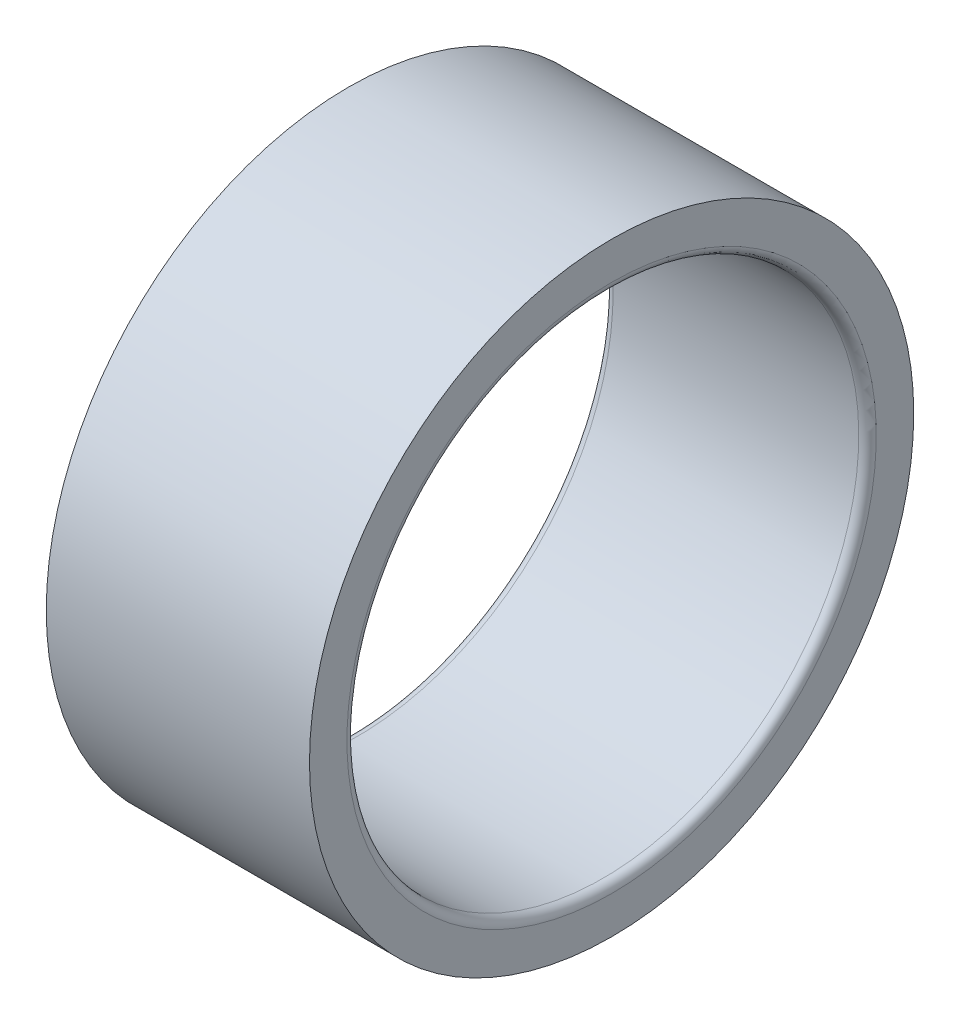
ISO-10303-21;
HEADER;
FILE_DESCRIPTION(('STEP AP214'),'2;1');
FILE_NAME('part.step','',(''),(''),'','','');
FILE_SCHEMA(('AUTOMOTIVE_DESIGN { 1 0 10303 214 1 1 1 1 }'));
ENDSEC;
DATA;
#1=APPLICATION_CONTEXT('core data for automotive mechanical design processes');
#2=APPLICATION_PROTOCOL_DEFINITION('international standard','automotive_design',2000,#1);
#3=PRODUCT_CONTEXT('',#1,'mechanical');
#4=PRODUCT('Part','Part','',(#3));
#5=PRODUCT_RELATED_PRODUCT_CATEGORY('part','',(#4));
#6=PRODUCT_DEFINITION_FORMATION('','',#4);
#7=PRODUCT_DEFINITION_CONTEXT('part definition',#1,'design');
#8=PRODUCT_DEFINITION('design','',#6,#7);
#9=PRODUCT_DEFINITION_SHAPE('','',#8);
#10=(LENGTH_UNIT() NAMED_UNIT(*) SI_UNIT(.MILLI.,.METRE.));
#11=(NAMED_UNIT(*) PLANE_ANGLE_UNIT() SI_UNIT($,.RADIAN.));
#12=(NAMED_UNIT(*) SI_UNIT($,.STERADIAN.) SOLID_ANGLE_UNIT());
#13=UNCERTAINTY_MEASURE_WITH_UNIT(LENGTH_MEASURE(1.E-05),#10,'distance_accuracy_value','');
#14=(GEOMETRIC_REPRESENTATION_CONTEXT(3) GLOBAL_UNCERTAINTY_ASSIGNED_CONTEXT((#13)) GLOBAL_UNIT_ASSIGNED_CONTEXT((#10,
#11,#12)) REPRESENTATION_CONTEXT('',''));
#15=CARTESIAN_POINT('',(0.,0.,0.));
#16=DIRECTION('',(0.,0.,1.));
#17=DIRECTION('',(1.,0.,0.));
#18=AXIS2_PLACEMENT_3D('',#15,#16,#17);
#19=CARTESIAN_POINT('',(23.,19.38,0.));
#20=DIRECTION('',(1.,0.,0.));
#21=DIRECTION('',(0.,1.,0.));
#22=AXIS2_PLACEMENT_3D('',#19,#20,#21);
#23=PLANE('',#22);
#24=CARTESIAN_POINT('',(23.,0.,0.));
#25=DIRECTION('',(1.,0.,0.));
#26=DIRECTION('',(0.,1.,0.));
#27=AXIS2_PLACEMENT_3D('',#24,#25,#26);
#28=CIRCLE('',#27,20.66);
#29=CARTESIAN_POINT('',(23.,20.66,0.));
#30=VERTEX_POINT('',#29);
#31=EDGE_CURVE('E11',#30,#30,#28,.T.);
#32=ORIENTED_EDGE('',*,*,#31,.T.);
#33=EDGE_LOOP('',(#32));
#34=FACE_BOUND('',#33,.T.);
#35=CARTESIAN_POINT('',(23.,0.,0.));
#36=DIRECTION('',(1.,0.,0.));
#37=DIRECTION('',(0.,1.,0.));
#38=AXIS2_PLACEMENT_3D('',#35,#36,#37);
#39=CIRCLE('',#38,18.1);
#40=CARTESIAN_POINT('',(23.,18.1,0.));
#41=VERTEX_POINT('',#40);
#42=EDGE_CURVE('E49',#41,#41,#39,.T.);
#43=ORIENTED_EDGE('',*,*,#42,.F.);
#44=EDGE_LOOP('',(#43));
#45=FACE_BOUND('',#44,.T.);
#46=ADVANCED_FACE('F17',(#34,#45),#23,.T.);
#47=CARTESIAN_POINT('',(14.,0.,0.));
#48=DIRECTION('',(-1.,0.,0.));
#49=DIRECTION('',(0.,1.,0.));
#50=AXIS2_PLACEMENT_3D('',#47,#48,#49);
#51=CYLINDRICAL_SURFACE('',#50,20.66);
#52=CARTESIAN_POINT('',(5.,0.,0.));
#53=DIRECTION('',(1.,0.,0.));
#54=DIRECTION('',(0.,1.,0.));
#55=AXIS2_PLACEMENT_3D('',#52,#53,#54);
#56=CIRCLE('',#55,20.66);
#57=CARTESIAN_POINT('',(5.,20.66,0.));
#58=VERTEX_POINT('',#57);
#59=EDGE_CURVE('E30',#58,#58,#56,.T.);
#60=ORIENTED_EDGE('',*,*,#59,.T.);
#61=EDGE_LOOP('',(#60));
#62=FACE_BOUND('',#61,.T.);
#63=ORIENTED_EDGE('',*,*,#31,.F.);
#64=EDGE_LOOP('',(#63));
#65=FACE_BOUND('',#64,.T.);
#66=ADVANCED_FACE('F85',(#62,#65),#51,.T.);
#67=CARTESIAN_POINT('',(5.,19.38,0.));
#68=DIRECTION('',(-1.,0.,0.));
#69=DIRECTION('',(0.,-1.,0.));
#70=AXIS2_PLACEMENT_3D('',#67,#68,#69);
#71=PLANE('',#70);
#72=CARTESIAN_POINT('',(5.,0.,0.));
#73=DIRECTION('',(1.,0.,0.));
#74=DIRECTION('',(0.,1.,0.));
#75=AXIS2_PLACEMENT_3D('',#72,#73,#74);
#76=CIRCLE('',#75,18.1);
#77=CARTESIAN_POINT('',(5.,18.1,0.));
#78=VERTEX_POINT('',#77);
#79=EDGE_CURVE('E68',#78,#78,#76,.T.);
#80=ORIENTED_EDGE('',*,*,#79,.T.);
#81=EDGE_LOOP('',(#80));
#82=FACE_BOUND('',#81,.T.);
#83=ORIENTED_EDGE('',*,*,#59,.F.);
#84=EDGE_LOOP('',(#83));
#85=FACE_BOUND('',#84,.T.);
#86=ADVANCED_FACE('F88',(#82,#85),#71,.T.);
#87=CARTESIAN_POINT('',(5.6,0.,0.));
#88=DIRECTION('',(1.,0.,0.));
#89=DIRECTION('',(0.,0.,-1.));
#90=AXIS2_PLACEMENT_3D('',#87,#88,#89);
#91=TOROIDAL_SURFACE('',#90,18.1,0.6);
#92=CARTESIAN_POINT('',(5.6,0.,0.));
#93=DIRECTION('',(1.,0.,0.));
#94=DIRECTION('',(0.,1.,0.));
#95=AXIS2_PLACEMENT_3D('',#92,#93,#94);
#96=CIRCLE('',#95,17.5);
#97=CARTESIAN_POINT('',(5.6,17.5,0.));
#98=VERTEX_POINT('',#97);
#99=EDGE_CURVE('E78',#98,#98,#96,.T.);
#100=ORIENTED_EDGE('',*,*,#99,.T.);
#101=EDGE_LOOP('',(#100));
#102=FACE_BOUND('',#101,.T.);
#103=ORIENTED_EDGE('',*,*,#79,.F.);
#104=EDGE_LOOP('',(#103));
#105=FACE_BOUND('',#104,.T.);
#106=ADVANCED_FACE('F90',(#102,#105),#91,.T.);
#107=CARTESIAN_POINT('',(14.,0.,0.));
#108=DIRECTION('',(-1.,0.,0.));
#109=DIRECTION('',(0.,1.,0.));
#110=AXIS2_PLACEMENT_3D('',#107,#108,#109);
#111=CYLINDRICAL_SURFACE('',#110,17.5);
#112=CARTESIAN_POINT('',(22.4,0.,0.));
#113=DIRECTION('',(1.,0.,0.));
#114=DIRECTION('',(0.,1.,0.));
#115=AXIS2_PLACEMENT_3D('',#112,#113,#114);
#116=CIRCLE('',#115,17.5);
#117=CARTESIAN_POINT('',(22.4,17.5,0.));
#118=VERTEX_POINT('',#117);
#119=EDGE_CURVE('E55',#118,#118,#116,.T.);
#120=ORIENTED_EDGE('',*,*,#119,.T.);
#121=EDGE_LOOP('',(#120));
#122=FACE_BOUND('',#121,.T.);
#123=ORIENTED_EDGE('',*,*,#99,.F.);
#124=EDGE_LOOP('',(#123));
#125=FACE_BOUND('',#124,.T.);
#126=CARTESIAN_POINT('',(14.,17.4355957741627,1.50000000000002));
#127=CARTESIAN_POINT('',(14.0165377322841,17.4355962047545,1.49999468184523));
#128=CARTESIAN_POINT('',(14.0330756659081,17.4356193142774,1.49972636292717));
#129=CARTESIAN_POINT('',(14.0660447977551,17.4357111000412,1.4986590580446));
#130=CARTESIAN_POINT('',(14.0824760899928,17.4357795294778,1.49786294632444));
#131=CARTESIAN_POINT('',(14.1152320160811,17.4359617604761,1.49574013476894));
#132=CARTESIAN_POINT('',(14.1315568020204,17.4360753621799,1.49441577202287));
#133=CARTESIAN_POINT('',(14.1640996182594,17.4363475100774,1.49123709098417));
#134=CARTESIAN_POINT('',(14.1803178230468,17.4365059057266,1.4893845476449));
#135=CARTESIAN_POINT('',(14.21264747244,17.4368670916108,1.48515000226908));
#136=CARTESIAN_POINT('',(14.2287590749768,17.437069781389,1.48276919811611));
#137=CARTESIAN_POINT('',(14.2608755408956,17.4375188550157,1.47747867014835));
#138=CARTESIAN_POINT('',(14.2768805058706,17.4377651882524,1.47456955889435));
#139=CARTESIAN_POINT('',(14.3087837576683,17.4383007075638,1.46822292965823));
#140=CARTESIAN_POINT('',(14.3246820498578,17.4385898914654,1.46478543847047));
#141=CARTESIAN_POINT('',(14.3563720711119,17.439210125426,1.45738258916529));
#142=CARTESIAN_POINT('',(14.3721636704323,17.4395412192215,1.45341667936801));
#143=CARTESIAN_POINT('',(14.4036404031676,17.440244156598,1.44495737116878));
#144=CARTESIAN_POINT('',(14.4193252347524,17.4406160862452,1.44046285719836));
#145=CARTESIAN_POINT('',(14.4505887778107,17.4413993972878,1.43094721571647));
#146=CARTESIAN_POINT('',(14.466166982047,17.4418109023805,1.42592443214188));
#147=CARTESIAN_POINT('',(14.4972168534457,17.4426720835717,1.41535112702188));
#148=CARTESIAN_POINT('',(14.512687774789,17.4431219161491,1.40979842974237));
#149=CARTESIAN_POINT('',(14.543525681112,17.4440577463536,1.39817151269828));
#150=CARTESIAN_POINT('',(14.5588916707185,17.4445439241803,1.39209466773268));
#151=CARTESIAN_POINT('',(14.5893339509651,17.4455466735659,1.37947133040457));
#152=CARTESIAN_POINT('',(14.6044113408575,17.4460630716426,1.37292747891924));
#153=CARTESIAN_POINT('',(14.6343712639849,17.4471290692625,1.35931376552878));
#154=CARTESIAN_POINT('',(14.6492532140608,17.447678748784,1.35224262624219));
#155=CARTESIAN_POINT('',(14.6788250082017,17.4488089149655,1.33758055283151));
#156=CARTESIAN_POINT('',(14.693513956967,17.4493895063781,1.32998782213076));
#157=CARTESIAN_POINT('',(14.7226994076792,17.4505795529411,1.31428138878098));
#158=CARTESIAN_POINT('',(14.7371946665711,17.4511891319196,1.30616538618978));
#159=CARTESIAN_POINT('',(14.7659932780111,17.4524349192136,1.28941318121695));
#160=CARTESIAN_POINT('',(14.7802950231629,17.4530712618375,1.28077422675694));
#161=CARTESIAN_POINT('',(14.808706871061,17.4543682542299,1.26297623968503));
#162=CARTESIAN_POINT('',(14.822814986753,17.4550290407734,1.25381404655271));
#163=CARTESIAN_POINT('',(14.8503265528703,17.456347824097,1.23531541376225));
#164=CARTESIAN_POINT('',(14.8637385801868,17.4570053481119,1.22599169187315));
#165=CARTESIAN_POINT('',(14.89017233785,17.4583295990155,1.20698704500964));
#166=CARTESIAN_POINT('',(14.9031960623377,17.4589962363211,1.19730888914676));
#167=CARTESIAN_POINT('',(14.9288532917698,17.4603369220247,1.17759569411239));
#168=CARTESIAN_POINT('',(14.941488584844,17.4610109073221,1.16756297863165));
#169=CARTESIAN_POINT('',(14.9663692035351,17.4623644350587,1.1471410407835));
#170=CARTESIAN_POINT('',(14.9786160683633,17.4630439371244,1.13675369156936));
#171=CARTESIAN_POINT('',(15.0027200473808,17.4644065862459,1.11562281759471));
#172=CARTESIAN_POINT('',(15.0145784110608,17.4650897112287,1.10488071699346));
#173=CARTESIAN_POINT('',(15.0379058217213,17.4664576252319,1.08304082670923));
#174=CARTESIAN_POINT('',(15.0493757887594,17.467142405498,1.07194401939204));
#175=CARTESIAN_POINT('',(15.071934604425,17.4685121294588,1.04938627413892));
#176=CARTESIAN_POINT('',(15.0830237332056,17.4691970726432,1.03792561634463));
#177=CARTESIAN_POINT('',(15.1048514097171,17.4705665844619,1.01461319857303));
#178=CARTESIAN_POINT('',(15.115588858276,17.4712511463622,1.00276040922595));
#179=CARTESIAN_POINT('',(15.1367137348522,17.4726175130588,0.978664107467019));
#180=CARTESIAN_POINT('',(15.147099620217,17.4732992964236,0.966419241734223));
#181=CARTESIAN_POINT('',(15.1675217999983,17.4746576584946,0.94153900753597));
#182=CARTESIAN_POINT('',(15.1775561013675,17.4753341945184,0.928902001301308));
#183=CARTESIAN_POINT('',(15.1972754907033,17.4766795446289,0.903237617912115));
#184=CARTESIAN_POINT('',(15.2069581347489,17.4773482884533,0.890208359879206));
#185=CARTESIAN_POINT('',(15.2259749572517,17.4786754456919,0.863759914100381));
#186=CARTESIAN_POINT('',(15.2353062494033,17.4793337551389,0.85033864708409));
#187=CARTESIAN_POINT('',(15.2538062281117,17.4806507148086,0.822827815534325));
#188=CARTESIAN_POINT('',(15.26296281985,17.4813088463866,0.808730089760248));
#189=CARTESIAN_POINT('',(15.2807520291099,17.4825993006913,0.780334758412757));
#190=CARTESIAN_POINT('',(15.2893876774512,17.4832317638743,0.766039058922006));
#191=CARTESIAN_POINT('',(15.3061358362202,17.4844694268287,0.737248486417234));
#192=CARTESIAN_POINT('',(15.3142509632627,17.4850747574446,0.72275514178932));
#193=CARTESIAN_POINT('',(15.3299579957482,17.4862567109036,0.693569445055006));
#194=CARTESIAN_POINT('',(15.3375520630027,17.4868334492079,0.678878261303694));
#195=CARTESIAN_POINT('',(15.3522190191447,17.487956728082,0.649297953226103));
#196=CARTESIAN_POINT('',(15.3592935652384,17.4885033631448,0.634409654657429));
#197=CARTESIAN_POINT('',(15.3729162333055,17.4895650326003,0.604433073040378));
#198=CARTESIAN_POINT('',(15.3794654912428,17.4900801345802,0.589345308499022));
#199=CARTESIAN_POINT('',(15.3920980471221,17.4910799986989,0.558886260443189));
#200=CARTESIAN_POINT('',(15.3981788380188,17.4915645953583,0.543513933165951));
#201=CARTESIAN_POINT('',(15.4098131762858,17.4924958877359,0.512664139743066));
#202=CARTESIAN_POINT('',(15.4153693776949,17.4929427728728,0.497187680367622));
#203=CARTESIAN_POINT('',(15.425949171484,17.4937979094615,0.466127653216134));
#204=CARTESIAN_POINT('',(15.4309749728549,17.4942063203184,0.450544842857099));
#205=CARTESIAN_POINT('',(15.4404959981784,17.4949836785442,0.419273084131962));
#206=CARTESIAN_POINT('',(15.4449929155503,17.4953527514914,0.40358465456107));
#207=CARTESIAN_POINT('',(15.4534562815318,17.4960506284123,0.372101819549116));
#208=CARTESIAN_POINT('',(15.4574238867854,17.4963795200525,0.356307727094539));
#209=CARTESIAN_POINT('',(15.4648292846068,17.4969962205523,0.324613910963994));
#210=CARTESIAN_POINT('',(15.4682676731371,17.4972840755969,0.308714327454104));
#211=CARTESIAN_POINT('',(15.4746151750207,17.4978178889708,0.276809787773432));
#212=CARTESIAN_POINT('',(15.47752430852,17.4980638488948,0.260804835637517));
#213=CARTESIAN_POINT('',(15.482813888083,17.4985130551768,0.228689799353537));
#214=CARTESIAN_POINT('',(15.4851937705752,17.4987162559906,0.212579621762807));
#215=CARTESIAN_POINT('',(15.4894254305096,17.4990791243342,0.180254335682073));
#216=CARTESIAN_POINT('',(15.4912760604925,17.4992386972431,0.164039075991602));
#217=CARTESIAN_POINT('',(15.4944498009534,17.499513486427,0.131503795358816));
#218=CARTESIAN_POINT('',(15.4957711875976,17.4996285577117,0.115183605209851));
#219=CARTESIAN_POINT('',(15.4978870051563,17.4998135160433,0.0824385868249492));
#220=CARTESIAN_POINT('',(15.4986791506938,17.4998832070962,0.0660136100775184));
#221=CARTESIAN_POINT('',(15.499737073979,17.4999765725658,0.0330591494633104));
#222=CARTESIAN_POINT('',(15.5000000267365,17.5000000000009,0.0165295747865922));
#223=CARTESIAN_POINT('',(15.4999999732679,17.4999999999991,-0.0165269020826914));
#224=CARTESIAN_POINT('',(15.4997370520784,17.4999765801377,-0.0330538042752214));
#225=CARTESIAN_POINT('',(15.4986791572659,17.4998832435352,-0.0660034057205046));
#226=CARTESIAN_POINT('',(15.4978869934747,17.4998135723619,-0.082426195304076));
#227=CARTESIAN_POINT('',(15.4957711682957,17.499628663268,-0.115167325983189));
#228=CARTESIAN_POINT('',(15.4944497764568,17.4995136199538,-0.131485814584084));
#229=CARTESIAN_POINT('',(15.491276038031,17.499238891991,-0.164018179211151));
#230=CARTESIAN_POINT('',(15.4894253993274,17.4990793509771,-0.18023222289348));
#231=CARTESIAN_POINT('',(15.4851937389444,17.498716547553,-0.212555564595977));
#232=CARTESIAN_POINT('',(15.4828138487419,17.4985133784458,-0.228665011720699));
#233=CARTESIAN_POINT('',(15.4775242695994,17.4980642326007,-0.260779075248577));
#234=CARTESIAN_POINT('',(15.4746151284064,17.4978183001321,-0.276783782473803));
#235=CARTESIAN_POINT('',(15.4682676267647,17.4972845346395,-0.308688320847626));
#236=CARTESIAN_POINT('',(15.4648292306734,17.4969966987936,-0.324588144857618));
#237=CARTESIAN_POINT('',(15.4574238340302,17.4963800256368,-0.356282931365483));
#238=CARTESIAN_POINT('',(15.4534562225139,17.4960511409649,-0.372077750172731));
#239=CARTESIAN_POINT('',(15.4449928554707,17.4953532630246,-0.403562525823996));
#240=CARTESIAN_POINT('',(15.4404959289298,17.4949841809667,-0.419252165809673));
#241=CARTESIAN_POINT('',(15.4309749121562,17.4942067854388,-0.450526840071056));
#242=CARTESIAN_POINT('',(15.4259491149715,17.4937983453201,-0.466111351455582));
#243=CARTESIAN_POINT('',(15.4153692950443,17.4929431280839,-0.497175250799096));
#244=CARTESIAN_POINT('',(15.4098130503709,17.4924961905472,-0.512653876980692));
#245=CARTESIAN_POINT('',(15.3981788179102,17.4915647643904,-0.543508566839587));
#246=CARTESIAN_POINT('',(15.392098165449,17.4910800853694,-0.558883619893266));
#247=CARTESIAN_POINT('',(15.3794697792205,17.4900803971081,-0.589337311350539));
#248=CARTESIAN_POINT('',(15.3729249032593,17.4895655763558,-0.60441713930366));
#249=CARTESIAN_POINT('',(15.3593092178927,17.4885043981197,-0.634381013078034));
#250=CARTESIAN_POINT('',(15.3522371594609,17.4879579664744,-0.649264488839154));
#251=CARTESIAN_POINT('',(15.3375736127069,17.4868349949227,-0.67883841004286));
#252=CARTESIAN_POINT('',(15.3299803580818,17.4862583543783,-0.693527975356587));
#253=CARTESIAN_POINT('',(15.3142733424714,17.4850764723872,-0.722713684483569));
#254=CARTESIAN_POINT('',(15.3061573133859,17.4844711097985,-0.737208602495079));
#255=CARTESIAN_POINT('',(15.2894056782911,17.4832332369528,-0.766005528951064));
#256=CARTESIAN_POINT('',(15.2807673534716,17.4826005906313,-0.780305949282278));
#257=CARTESIAN_POINT('',(15.2629713975408,17.4813095916185,-0.808714118906011));
#258=CARTESIAN_POINT('',(15.2538106403655,17.4806510936236,-0.822819902350825));
#259=CARTESIAN_POINT('',(15.2353118123935,17.4793340882834,-0.850331687684631));
#260=CARTESIAN_POINT('',(15.225986304684,17.4786761197652,-0.863746165545007));
#261=CARTESIAN_POINT('',(15.2069786556704,17.4773495417373,-0.890183696242185));
#262=CARTESIAN_POINT('',(15.1972993139878,17.4766810327174,-0.903208765733293));
#263=CARTESIAN_POINT('',(15.1775844116866,17.4753360206929,-0.928867625561224));
#264=CARTESIAN_POINT('',(15.1675512055475,17.4746595852938,-0.9415032279667));
#265=CARTESIAN_POINT('',(15.1471290431813,17.4733012753184,-0.966383479508949));
#266=CARTESIAN_POINT('',(15.1367419909976,17.4726194415213,-0.978629693275746));
#267=CARTESIAN_POINT('',(15.1156125582352,17.4712528104433,-1.00273146520462));
#268=CARTESIAN_POINT('',(15.1048716326184,17.4705680334254,-1.01458829978625));
#269=CARTESIAN_POINT('',(15.0830350280669,17.4691978960631,-1.03791183261763));
#270=CARTESIAN_POINT('',(15.071940362,17.4685125420462,-1.04937947935102));
#271=CARTESIAN_POINT('',(15.0493825855491,17.467142755208,-1.07193826003701));
#272=CARTESIAN_POINT('',(15.0379196094678,17.4664583221437,-1.08302952826798));
#273=CARTESIAN_POINT('',(15.0146033151967,17.4650909889374,-1.10486048918264));
#274=CARTESIAN_POINT('',(15.0027489960791,17.464408098418,-1.11559911323829));
#275=CARTESIAN_POINT('',(14.9786504851341,17.4630457758852,-1.13672543267231));
#276=CARTESIAN_POINT('',(14.9664049669106,17.4623663673411,-1.14711161620881));
#277=CARTESIAN_POINT('',(14.9415243627386,17.4610128741781,-1.16753357378607));
#278=CARTESIAN_POINT('',(14.9288876644409,17.4603388318471,-1.17756738566901));
#279=CARTESIAN_POINT('',(14.9032249094648,17.4589978717591,-1.19728506944962));
#280=CARTESIAN_POINT('',(14.8901969958557,17.4583310194753,-1.20696652820474));
#281=CARTESIAN_POINT('',(14.8637523245898,17.4570061477946,-1.22598034756247));
#282=CARTESIAN_POINT('',(14.8503335101879,17.4563482205757,-1.23530985232024));
#283=CARTESIAN_POINT('',(14.8228229005375,17.455029355343,-1.25380963409024));
#284=CARTESIAN_POINT('',(14.8087228429876,17.4543688725992,-1.26296766160977));
#285=CARTESIAN_POINT('',(14.7803238320736,17.453072385226,-1.28075890283145));
#286=CARTESIAN_POINT('',(14.7660268060626,17.4524362477935,-1.28939518184505));
#287=CARTESIAN_POINT('',(14.7372345450651,17.4511907386954,-1.30614391250667));
#288=CARTESIAN_POINT('',(14.7227408577699,17.4505812376749,-1.31425901405718));
#289=CARTESIAN_POINT('',(14.6935554165907,17.4493912107533,-1.32996546583254));
#290=CARTESIAN_POINT('',(14.678864848326,17.4488105667477,-1.33755900973589));
#291=CARTESIAN_POINT('',(14.6492866667469,17.447680155251,-1.35222449275228));
#292=CARTESIAN_POINT('',(14.6343998943607,17.4471302893875,-1.35929811936309));
#293=CARTESIAN_POINT('',(14.6044272673699,17.4460637552054,-1.3729188131587));
#294=CARTESIAN_POINT('',(14.5893419443706,17.445547014019,-1.37946704470216));
#295=CARTESIAN_POINT('',(14.5588943105027,17.4445439336236,-1.39209454868416));
#296=CARTESIAN_POINT('',(14.543531046146,17.4440577448293,-1.39817153089865));
#297=CARTESIAN_POINT('',(14.5126980345765,17.4431219063753,-1.40979855190796));
#298=CARTESIAN_POINT('',(14.4972292788781,17.4426720772284,-1.41535120523795));
#299=CARTESIAN_POINT('',(14.466183277395,17.4418108982161,-1.42592448293721));
#300=CARTESIAN_POINT('',(14.4506067730696,17.4413993927984,-1.43094727009796));
#301=CARTESIAN_POINT('',(14.4193461433648,17.4406160811603,-1.44046291912609));
#302=CARTESIAN_POINT('',(14.4036625211256,17.4402441522504,-1.44495742351832));
#303=CARTESIAN_POINT('',(14.3721877270741,17.4395412150127,-1.45341672998875));
#304=CARTESIAN_POINT('',(14.3563968532209,17.4392101217256,-1.45738263326718));
#305=CARTESIAN_POINT('',(14.3247078009157,17.4385898877029,-1.46478548344403));
#306=CARTESIAN_POINT('',(14.3088097486853,17.4383007044191,-1.46822296702827));
#307=CARTESIAN_POINT('',(14.2769064946486,17.437765185078,-1.47456959641582));
#308=CARTESIAN_POINT('',(14.2609012843748,17.4375188524493,-1.47747869994394));
#309=CARTESIAN_POINT('',(14.2287838461468,17.4370697788038,-1.48276922901151));
#310=CARTESIAN_POINT('',(14.2126715139837,17.4368670897045,-1.48515002619077));
#311=CARTESIAN_POINT('',(14.1803399193455,17.4365059036431,-1.48938457049518));
#312=CARTESIAN_POINT('',(14.1641204968406,17.4363475084748,-1.49123710378203));
#313=CARTESIAN_POINT('',(14.1315747728915,17.4360753609188,-1.49441579269161));
#314=CARTESIAN_POINT('',(14.11524829545,17.4359617604282,-1.49574015748202));
#315=CARTESIAN_POINT('',(14.0824884600149,17.4357795277154,-1.49786294460139));
#316=CARTESIAN_POINT('',(14.0660549487424,17.4357110966834,-1.49865901391982));
#317=CARTESIAN_POINT('',(14.0330810529732,17.4356193168037,-1.49972641717478));
#318=CARTESIAN_POINT('',(14.0165405748436,17.4355962161356,-1.49999486242922));
#319=CARTESIAN_POINT('',(13.9834874572815,17.4355953329388,-1.50000512886381));
#320=CARTESIAN_POINT('',(13.9669748181764,17.4356174736736,-1.49974784176863));
#321=CARTESIAN_POINT('',(13.9340515389759,17.4357075745795,-1.49869998653806));
#322=CARTESIAN_POINT('',(13.9176408112745,17.4357752983743,-1.4979121695165));
#323=CARTESIAN_POINT('',(13.8849214686909,17.4359562483993,-1.49580440520718));
#324=CARTESIAN_POINT('',(13.8686127112903,17.4360692865354,-1.49448665752298));
#325=CARTESIAN_POINT('',(13.8360973506199,17.4363404701846,-1.49131939100737));
#326=CARTESIAN_POINT('',(13.8198905875094,17.4364984773531,-1.48947150298289));
#327=CARTESIAN_POINT('',(13.7875792287105,17.4368590394329,-1.48524453496819));
#328=CARTESIAN_POINT('',(13.7714744951085,17.4370615065109,-1.48286650217292));
#329=CARTESIAN_POINT('',(13.7393671650875,17.4375102883254,-1.47757976939083));
#330=CARTESIAN_POINT('',(13.723364492869,17.4377565652791,-1.47467152661998));
#331=CARTESIAN_POINT('',(13.6914612199296,17.4382921223032,-1.46832489563292));
#332=CARTESIAN_POINT('',(13.6755606455499,17.4385814130402,-1.46488637591095));
#333=CARTESIAN_POINT('',(13.6438614464699,17.439202007444,-1.45747973288064));
#334=CARTESIAN_POINT('',(13.6280629890546,17.4395333674928,-1.45351089845384));
#335=CARTESIAN_POINT('',(13.5965679232747,17.4402369801679,-1.44504399916781));
#336=CARTESIAN_POINT('',(13.5808716598386,17.4406093311166,-1.44054465990176));
#337=CARTESIAN_POINT('',(13.5495806220451,17.4413936206474,-1.43101764544039));
#338=CARTESIAN_POINT('',(13.5339864029763,17.441805694585,-1.42598815791274));
#339=CARTESIAN_POINT('',(13.5028998990122,17.4426681496934,-1.41539963825077));
#340=CARTESIAN_POINT('',(13.4874084126652,17.4431186983127,-1.40983827727041));
#341=CARTESIAN_POINT('',(13.4565246441758,17.4440560655505,-1.3981925269105));
#342=CARTESIAN_POINT('',(13.4411334122616,17.4445430741653,-1.39210536802126));
#343=CARTESIAN_POINT('',(13.4106661552541,17.4455466937004,-1.37947107725232));
#344=CARTESIAN_POINT('',(13.3955886876325,17.4460630770448,-1.37292741099664));
#345=CARTESIAN_POINT('',(13.3656287074272,17.4471290638475,-1.35931383361249));
#346=CARTESIAN_POINT('',(13.3507467782496,17.4476787473308,-1.35224264451377));
#347=CARTESIAN_POINT('',(13.3211749994723,17.4488089164252,-1.33758053447846));
#348=CARTESIAN_POINT('',(13.3064860450759,17.4493895067707,-1.32998781719501));
#349=CARTESIAN_POINT('',(13.2773005902189,17.450579552548,-1.31428139372317));
#350=CARTESIAN_POINT('',(13.2628053328471,17.4511891318144,-1.30616538751194));
#351=CARTESIAN_POINT('',(13.2340067225305,17.4524349193205,-1.2894131798721));
#352=CARTESIAN_POINT('',(13.2197049769707,17.4530712618665,-1.28077422639187));
#353=CARTESIAN_POINT('',(13.1912931287777,17.4543682542014,-1.26297624004357));
#354=CARTESIAN_POINT('',(13.1771850132021,17.4550290407659,-1.25381404664659));
#355=CARTESIAN_POINT('',(13.1496734471661,17.4563478241046,-1.23531541366622));
#356=CARTESIAN_POINT('',(13.1362614198187,17.4570053481144,-1.2259916918419));
#357=CARTESIAN_POINT('',(13.1098276621309,17.4583295990143,-1.20698704502269));
#358=CARTESIAN_POINT('',(13.0968039376493,17.4589962363215,-1.19730888913993));
#359=CARTESIAN_POINT('',(13.0711467082207,17.4603369220263,-1.17759569408998));
#360=CARTESIAN_POINT('',(13.058511415144,17.4610109073234,-1.16756297861343));
#361=CARTESIAN_POINT('',(13.0336307964514,17.4623644350597,-1.14714104076879));
#362=CARTESIAN_POINT('',(13.0213839316242,17.4630439371254,-1.13675369155404));
#363=CARTESIAN_POINT('',(12.9972799526091,17.4644065862468,-1.115622817581));
#364=CARTESIAN_POINT('',(12.9854215889304,17.4650897112294,-1.10488071698201));
#365=CARTESIAN_POINT('',(12.9620941782738,17.4664576252323,-1.08304082670308));
#366=CARTESIAN_POINT('',(12.9506242112382,17.4671424054982,-1.07194401938898));
#367=CARTESIAN_POINT('',(12.9280653955744,17.4685121294587,-1.04938627413924));
#368=CARTESIAN_POINT('',(12.9169762667933,17.4691970726432,-1.03792561634514));
#369=CARTESIAN_POINT('',(12.895148590281,17.4705665844619,-1.01461319857381));
#370=CARTESIAN_POINT('',(12.8844111417219,17.4712511463621,-1.00276040922681));
#371=CARTESIAN_POINT('',(12.8632862651452,17.4726175130587,-0.97866410746799));
#372=CARTESIAN_POINT('',(12.8529003797803,17.4732992964236,-0.966419241735233));
#373=CARTESIAN_POINT('',(12.832478199999,17.4746576584946,-0.941539007536989));
#374=CARTESIAN_POINT('',(12.8224438986299,17.4753341945183,-0.928902001302298));
#375=CARTESIAN_POINT('',(12.8027245092946,17.4766795446288,-0.903237617912981));
#376=CARTESIAN_POINT('',(12.7930418652492,17.4773482884532,-0.890208359879977));
#377=CARTESIAN_POINT('',(12.7740250427473,17.4786754456919,-0.86375991410085));
#378=CARTESIAN_POINT('',(12.7646937505962,17.4793337551389,-0.850338647084352));
#379=CARTESIAN_POINT('',(12.7461937718846,17.4806507148089,-0.822827815528003));
#380=CARTESIAN_POINT('',(12.7370371801426,17.4813088463872,-0.808730089747419));
#381=CARTESIAN_POINT('',(12.7192479708768,17.4825993006923,-0.780334758389513));
#382=CARTESIAN_POINT('',(12.7106123225332,17.4832317638755,-0.766039058894904));
#383=CARTESIAN_POINT('',(12.6938641637613,17.4844694268301,-0.737248486384945));
#384=CARTESIAN_POINT('',(12.6857490367179,17.485074757446,-0.722755141755754));
#385=CARTESIAN_POINT('',(12.6700420042325,17.4862567109049,-0.693569445021415));
#386=CARTESIAN_POINT('',(12.6624479369786,17.4868334492091,-0.678878261271404));
#387=CARTESIAN_POINT('',(12.6477809808396,17.487956728083,-0.649297953198974));
#388=CARTESIAN_POINT('',(12.6407064347481,17.4885033631456,-0.634409654634206));
#389=CARTESIAN_POINT('',(12.627083766687,17.4895650326007,-0.604433073027435));
#390=CARTESIAN_POINT('',(12.6205345087535,17.4900801345804,-0.589345308492496));
#391=CARTESIAN_POINT('',(12.6079019528779,17.4910799986989,-0.558886260440381));
#392=CARTESIAN_POINT('',(12.6018211619813,17.4915645953585,-0.543513933160319));
#393=CARTESIAN_POINT('',(12.5901868237143,17.4924958877362,-0.512664139732344));
#394=CARTESIAN_POINT('',(12.5846306223052,17.4929427728732,-0.497187680354639));
#395=CARTESIAN_POINT('',(12.5740508285161,17.493797909462,-0.466127653199114));
#396=CARTESIAN_POINT('',(12.5690250271452,17.4942063203189,-0.450544842838307));
#397=CARTESIAN_POINT('',(12.5595040018217,17.4949836785448,-0.41927308411014));
#398=CARTESIAN_POINT('',(12.5550070844498,17.495352751492,-0.403584654537994));
#399=CARTESIAN_POINT('',(12.5465437184683,17.4960506284129,-0.372101819524039));
#400=CARTESIAN_POINT('',(12.5425761132147,17.496379520053,-0.356307727068718));
#401=CARTESIAN_POINT('',(12.5351707153932,17.4969962205528,-0.32461391093718));
#402=CARTESIAN_POINT('',(12.531732326863,17.4972840755974,-0.308714327427044));
#403=CARTESIAN_POINT('',(12.5253848249794,17.4978178889712,-0.276809787746378));
#404=CARTESIAN_POINT('',(12.52247569148,17.4980638488952,-0.260804835610719));
#405=CARTESIAN_POINT('',(12.517186111917,17.4985130551772,-0.228689799327761));
#406=CARTESIAN_POINT('',(12.5148062294249,17.4987162559909,-0.212579621737799));
#407=CARTESIAN_POINT('',(12.5105745694904,17.4990791243344,-0.180254335659102));
#408=CARTESIAN_POINT('',(12.5087239395075,17.4992386972433,-0.164039075969901));
#409=CARTESIAN_POINT('',(12.5055501990467,17.4995134864272,-0.131503795340167));
#410=CARTESIAN_POINT('',(12.5042288124024,17.4996285577118,-0.115183605192985));
#411=CARTESIAN_POINT('',(12.5021129948437,17.4998135160434,-0.0824385868121499));
#412=CARTESIAN_POINT('',(12.5013208493062,17.4998832070963,-0.0660136100670041));
#413=CARTESIAN_POINT('',(12.500262926021,17.4999765725658,-0.0330591494578728));
#414=CARTESIAN_POINT('',(12.4999999732635,17.5000000000009,-0.0165295747839469));
#415=CARTESIAN_POINT('',(12.5000000267321,17.4999999999991,0.0165269020799285));
#416=CARTESIAN_POINT('',(12.5002629479216,17.4999765801377,0.0330538042698424));
#417=CARTESIAN_POINT('',(12.5013208427341,17.4998832435352,0.0660034057103648));
#418=CARTESIAN_POINT('',(12.5021130065253,17.4998135723619,0.0824261952917911));
#419=CARTESIAN_POINT('',(12.5042288317043,17.4996286632681,0.115167325967096));
#420=CARTESIAN_POINT('',(12.5055502235432,17.4995136199539,0.131485814566328));
#421=CARTESIAN_POINT('',(12.5087239619691,17.4992388919912,0.164018179190545));
#422=CARTESIAN_POINT('',(12.5105746006726,17.4990793509773,0.180232222871686));
#423=CARTESIAN_POINT('',(12.5148062610557,17.4987165475533,0.212555564572287));
#424=CARTESIAN_POINT('',(12.5171861512581,17.4985133784461,0.228665011696298));
#425=CARTESIAN_POINT('',(12.5224757304006,17.4980642326011,0.260779075223231));
#426=CARTESIAN_POINT('',(12.5253848715936,17.4978183001325,0.276783782448222));
#427=CARTESIAN_POINT('',(12.5317323732353,17.4972845346399,0.308688320822054));
#428=CARTESIAN_POINT('',(12.5351707693266,17.496996698794,0.324588144832288));
#429=CARTESIAN_POINT('',(12.5425761659699,17.4963800256373,0.35628293134112));
#430=CARTESIAN_POINT('',(12.5465437774862,17.4960511409654,0.372077750149091));
#431=CARTESIAN_POINT('',(12.5550071445293,17.4953532630251,0.403562525802275));
#432=CARTESIAN_POINT('',(12.5595040710703,17.4949841809672,0.419252165789145));
#433=CARTESIAN_POINT('',(12.5690250878439,17.4942067854392,0.450526840053396));
#434=CARTESIAN_POINT('',(12.5740508850286,17.4937983453205,0.466111351439596));
#435=CARTESIAN_POINT('',(12.5846307049557,17.4929431280842,0.49717525078692));
#436=CARTESIAN_POINT('',(12.5901869496292,17.4924961905475,0.512653876970651));
#437=CARTESIAN_POINT('',(12.6018211820899,17.4915647643906,0.543508566834352));
#438=CARTESIAN_POINT('',(12.6079018345509,17.4910800853695,0.558883619890698));
#439=CARTESIAN_POINT('',(12.6205302207774,17.4900803971082,0.589337311347843));
#440=CARTESIAN_POINT('',(12.6270750967364,17.489565576356,0.604417139298242));
#441=CARTESIAN_POINT('',(12.6406907820995,17.4885043981201,0.634381013068253));
#442=CARTESIAN_POINT('',(12.6477628405301,17.4879579664748,0.649264488827713));
#443=CARTESIAN_POINT('',(12.6624263872824,17.4868349949232,0.678838410029201));
#444=CARTESIAN_POINT('',(12.6700196419071,17.4862583543789,0.69352797534235));
#445=CARTESIAN_POINT('',(12.6857266575175,17.4850764723878,0.722713684469314));
#446=CARTESIAN_POINT('',(12.6938426866035,17.4844711097991,0.737208602481361));
#447=CARTESIAN_POINT('',(12.7105943216999,17.4832332369533,0.766005528939523));
#448=CARTESIAN_POINT('',(12.7192326465207,17.4826005906318,0.780305949272353));
#449=CARTESIAN_POINT('',(12.7370286024549,17.4813095916188,0.808714118900455));
#450=CARTESIAN_POINT('',(12.7461893596323,17.4806510936238,0.822819902347998));
#451=CARTESIAN_POINT('',(12.7646881876063,17.4793340882834,0.850331687683765));
#452=CARTESIAN_POINT('',(12.7740136953156,17.4786761197652,0.863746165543446));
#453=CARTESIAN_POINT('',(12.7930213443288,17.4773495417374,0.890183696239532));
#454=CARTESIAN_POINT('',(12.8027006860113,17.4766810327175,0.903208765730238));
#455=CARTESIAN_POINT('',(12.8224155883123,17.4753360206931,0.928867625557609));
#456=CARTESIAN_POINT('',(12.8324487944514,17.474659585294,0.941503227962925));
#457=CARTESIAN_POINT('',(12.8528709568176,17.4733012753187,0.966383479505173));
#458=CARTESIAN_POINT('',(12.8632580090013,17.4726194415215,0.978629693272124));
#459=CARTESIAN_POINT('',(12.8843874417639,17.4712528104434,1.00273146520155));
#460=CARTESIAN_POINT('',(12.8951283673809,17.4705680334255,1.01458829978358));
#461=CARTESIAN_POINT('',(12.9169649719327,17.4691978960632,1.03791183261607));
#462=CARTESIAN_POINT('',(12.9280596379998,17.4685125420462,1.04937947935016));
#463=CARTESIAN_POINT('',(12.9506174144499,17.467142755208,1.07193826003645));
#464=CARTESIAN_POINT('',(12.9620803905302,17.4664583221437,1.08302952826706));
#465=CARTESIAN_POINT('',(12.9853966847998,17.4650909889375,1.10486048918077));
#466=CARTESIAN_POINT('',(12.997251003917,17.4644080984182,1.1155991132358));
#467=CARTESIAN_POINT('',(13.0213495148608,17.4630457758853,1.13672543267039));
#468=CARTESIAN_POINT('',(13.0335950330836,17.4623663673411,1.14711161620808));
#469=CARTESIAN_POINT('',(13.0584756372571,17.4610128741784,1.16753357378186));
#470=CARTESIAN_POINT('',(13.071112335557,17.4603388318478,1.17756738566011));
#471=CARTESIAN_POINT('',(13.0967750905284,17.4589978717587,1.19728506945425));
#472=CARTESIAN_POINT('',(13.1098030041305,17.4583310194734,1.2069665282277));
#473=CARTESIAN_POINT('',(13.1362476754187,17.4570061477967,1.22598034753675));
#474=CARTESIAN_POINT('',(13.1496664898501,17.4563482205831,1.2353098522269));
#475=CARTESIAN_POINT('',(13.1771770994252,17.4550293553352,1.25380963418758));
#476=CARTESIAN_POINT('',(13.1912771568663,17.4543688725702,1.26296766197475));
#477=CARTESIAN_POINT('',(13.2196761680873,17.4530723852541,1.28075890247845));
#478=CARTESIAN_POINT('',(13.2339731945106,17.4524362478994,1.28939518051473));
#479=CARTESIAN_POINT('',(13.2627654543907,17.451190738589,1.30614391384532));
#480=CARTESIAN_POINT('',(13.2772591401671,17.4505812372805,1.31425901901644));
#481=CARTESIAN_POINT('',(13.3064445854922,17.4493912111446,1.32996546091338));
#482=CARTESIAN_POINT('',(13.3211351593893,17.4488105682065,1.33755899139476));
#483=CARTESIAN_POINT('',(13.3507133255898,17.447680153796,1.35222451104675));
#484=CARTESIAN_POINT('',(13.3656000770558,17.4471302839683,1.35929818749926));
#485=CARTESIAN_POINT('',(13.3955727611641,17.4460637606115,1.37291874518765));
#486=CARTESIAN_POINT('',(13.4106581619755,17.4455470341719,1.37946679131987));
#487=CARTESIAN_POINT('',(13.4411307721993,17.4445430834838,1.39210525054338));
#488=CARTESIAN_POINT('',(13.4565192784081,17.4440560637343,1.39819254875837));
#489=CARTESIAN_POINT('',(13.4873981514488,17.4431186879663,1.40983840652424));
#490=CARTESIAN_POINT('',(13.5028874718476,17.4426681426529,1.41539972506073));
#491=CARTESIAN_POINT('',(13.5339701053722,17.4418056895015,1.42598821995353));
#492=CARTESIAN_POINT('',(13.5495626242863,17.4413936151372,1.43101771226804));
#493=CARTESIAN_POINT('',(13.5808507483414,17.4406093248369,1.44054473628885));
#494=CARTESIAN_POINT('',(13.5965458022687,17.4402369745483,1.44504406685008));
#495=CARTESIAN_POINT('',(13.6280389290915,17.4395333618991,1.45351096570653));
#496=CARTESIAN_POINT('',(13.6438366609182,17.4392020023199,1.45747979407899));
#497=CARTESIAN_POINT('',(13.6755348909923,17.438581407768,1.46488643879074));
#498=CARTESIAN_POINT('',(13.6914352254721,17.4382921175997,1.46832495127497));
#499=CARTESIAN_POINT('',(13.7233385004217,17.4377565606234,1.47467158188909));
#500=CARTESIAN_POINT('',(13.7393414176513,17.4375102844045,1.4775798160443));
#501=CARTESIAN_POINT('',(13.7714497210181,17.4370615023076,1.48286655122384));
#502=CARTESIAN_POINT('',(13.7875551855755,17.4368590355198,1.48524457921475));
#503=CARTESIAN_POINT('',(13.8198684865456,17.4364984745493,1.4894715374833));
#504=CARTESIAN_POINT('',(13.8360764629625,17.4363404695448,1.49131940454625));
#505=CARTESIAN_POINT('',(13.8685947442748,17.4360692819991,1.49448670442018));
#506=CARTESIAN_POINT('',(13.8849052105933,17.435956239137,1.49580449062699));
#507=CARTESIAN_POINT('',(13.9176284160335,17.4357753041559,1.49791212473389));
#508=CARTESIAN_POINT('',(13.9340412985149,17.435707601589,1.49869975630879));
#509=CARTESIAN_POINT('',(13.9669695189763,17.4356174447456,1.49974809387277));
#510=CARTESIAN_POINT('',(13.9834849458047,17.4355952276689,1.50000603764278));
#511=CARTESIAN_POINT('',(14.,17.4355957741627,1.50000000000002));
#512=B_SPLINE_CURVE_WITH_KNOTS('',3,(#126,#127,#128,#129,#130,#131,#132,#133,#134,#135,#136,
#137,#138,#139,#140,#141,#142,#143,#144,#145,#146,#147,#148,#149,#150,#151,#152,#153,#154,#155,
#156,#157,#158,#159,#160,#161,#162,#163,#164,#165,#166,#167,#168,#169,#170,#171,#172,#173,#174,
#175,#176,#177,#178,#179,#180,#181,#182,#183,#184,#185,#186,#187,#188,#189,#190,#191,#192,#193,
#194,#195,#196,#197,#198,#199,#200,#201,#202,#203,#204,#205,#206,#207,#208,#209,#210,#211,#212,
#213,#214,#215,#216,#217,#218,#219,#220,#221,#222,#223,#224,#225,#226,#227,#228,#229,#230,#231,
#232,#233,#234,#235,#236,#237,#238,#239,#240,#241,#242,#243,#244,#245,#246,#247,#248,#249,#250,
#251,#252,#253,#254,#255,#256,#257,#258,#259,#260,#261,#262,#263,#264,#265,#266,#267,#268,#269,
#270,#271,#272,#273,#274,#275,#276,#277,#278,#279,#280,#281,#282,#283,#284,#285,#286,#287,#288,
#289,#290,#291,#292,#293,#294,#295,#296,#297,#298,#299,#300,#301,#302,#303,#304,#305,#306,#307,
#308,#309,#310,#311,#312,#313,#314,#315,#316,#317,#318,#319,#320,#321,#322,#323,#324,#325,#326,
#327,#328,#329,#330,#331,#332,#333,#334,#335,#336,#337,#338,#339,#340,#341,#342,#343,#344,#345,
#346,#347,#348,#349,#350,#351,#352,#353,#354,#355,#356,#357,#358,#359,#360,#361,#362,#363,#364,
#365,#366,#367,#368,#369,#370,#371,#372,#373,#374,#375,#376,#377,#378,#379,#380,#381,#382,#383,
#384,#385,#386,#387,#388,#389,#390,#391,#392,#393,#394,#395,#396,#397,#398,#399,#400,#401,#402,
#403,#404,#405,#406,#407,#408,#409,#410,#411,#412,#413,#414,#415,#416,#417,#418,#419,#420,#421,
#422,#423,#424,#425,#426,#427,#428,#429,#430,#431,#432,#433,#434,#435,#436,#437,#438,#439,#440,
#441,#442,#443,#444,#445,#446,#447,#448,#449,#450,#451,#452,#453,#454,#455,#456,#457,#458,#459,
#460,#461,#462,#463,#464,#465,#466,#467,#468,#469,#470,#471,#472,#473,#474,#475,#476,#477,#478,
#479,#480,#481,#482,#483,#484,#485,#486,#487,#488,#489,#490,#491,#492,#493,#494,#495,#496,#497,
#498,#499,#500,#501,#502,#503,#504,#505,#506,#507,#508,#509,#510,#511),.UNSPECIFIED.,.F.,.F.,(4,
2,2,2,2,2,2,2,2,2,2,2,2,2,2,2,2,2,2,2,2,2,2,2,2,2,2,2,2,2,2,2,2,2,2,2,2,2,2,2,2,2,2,2,2,2,2,2,2,
2,2,2,2,2,2,2,2,2,2,2,2,2,2,2,2,2,2,2,2,2,2,2,2,2,2,2,2,2,2,2,2,2,2,2,2,2,2,2,2,2,2,2,2,2,2,2,2,
2,2,2,2,2,2,2,2,2,2,2,2,2,2,2,2,2,2,2,2,2,2,2,2,2,2,2,2,2,2,2,2,2,2,2,2,2,2,2,2,2,2,2,2,2,2,2,2,
2,2,2,2,2,2,2,2,2,2,2,2,2,2,2,2,2,2,2,2,2,2,2,2,2,2,2,2,2,2,2,2,2,2,2,2,2,2,2,2,2,2,2,2,2,2,2,
4),(0.,0.0496115143031702,0.0989550503595898,0.148082659961867,0.197047083530613,
0.245901589985808,0.294699808208943,0.343495552670161,0.392342646013037,0.441294741504753,
0.490405148264783,0.53972666207967,0.589311404402092,0.638635107946524,0.688082446190725,
0.737709584098724,0.787572079055281,0.837724706283552,0.888221296862709,0.937256407057662,
0.985967331273561,1.03440321125626,1.08261402982213,1.13065047233204,1.17856377754154,
1.22644104689803,1.274455916367,1.32265962054938,1.37110279489817,1.4198353284049,
1.46890622751516,1.5193672349608,1.56949876779107,1.61935450872295,1.66898903533734,
1.71845765740181,1.76781624240969,1.81742287504359,1.86676332492907,1.91588942108347,
1.96485367321358,2.01370911287767,2.06250912637856,2.11130728193181,2.16015715386513,
2.20911214671754,2.25822532211099,2.30754923116164,2.3571357549921,2.40671426106623,
2.45603161693698,2.50513970613908,2.55409107761676,2.60293878609411,2.65173622441743,
2.700536950435,2.74939451118329,2.79836226725013,2.84749322017894,2.89683984566332,
2.94645393506587,2.99578542003877,3.0452377446933,3.09486683256482,3.14472801242803,
3.19487584485352,3.24536396109763,3.29440820471597,3.34312471227752,3.39156253902973,
3.43977159094871,3.48780248713796,3.53570641146873,3.58359306177212,3.63161347758226,
3.67981894841568,3.72826017598674,3.77698712608397,3.82604889154402,3.87651837913113,
3.92665471013084,3.97651176725753,4.02614434280621,4.07560797507771,4.12495877275686,
4.17453606661949,4.22385141126025,4.27295696598893,4.32190556077656,4.37075053489704,
4.41954556744116,4.46834450231102,4.51720117050925,4.56616921264071,4.61530190453592,
4.66465198878714,4.714271514767,4.76380694809753,4.81308746873327,4.86216551594058,
4.91109417999163,4.95992703838035,5.0087179842135,5.05752104944768,5.10639022583767,
5.15537928654867,5.20454161135994,5.25393001825026,5.30359660391776,5.35292030747713,
5.40236764573026,5.45199478364122,5.50185727859484,5.55200990581432,5.60250649637893,
5.65154160658538,5.70025253080824,5.74868841079325,5.79689922935674,5.84493567185951,
5.89284897705707,5.94072624641423,5.98874111588361,6.0369448200661,6.08538799441477,
6.13412052792122,6.183191427031,6.23365243449903,6.28378396734277,6.33363970827914,
6.38327423488908,6.43274285694018,6.48210144192584,6.53170807456749,6.58104852445941,
6.63017462061887,6.67913887275261,6.72799431241887,6.77679432592049,6.82559248147299,
6.87444235340403,6.92339734625266,6.97251052164079,7.02183443068459,7.07142095450667,
7.12099946057296,7.17031681643728,7.21942490563441,7.26837627710855,7.31722398558379,
7.36602142390642,7.41482214992471,7.46367971067511,7.5126474667454,7.56177841967898,
7.61112504516944,7.66073913457933,7.71007061954212,7.75952294419055,7.80915203205997,
7.85901321192522,7.90916104435687,7.95964916061132,8.00869340422757,8.05740991178791,
8.10584773853968,8.15405679045909,8.20208768664952,8.24999161098225,8.29787826128255,
8.34589867709087,8.39410414792367,8.44254537549538,8.49127232559453,8.54033409105782,
8.59080357865477,8.64093990966041,8.69079696678906,8.74042954233577,8.78989317460138,
8.83924397227076,8.88890311058472,8.93828534914094,8.98744282247969,9.03642838279279,
9.08529544007698,9.13409779340826,9.1828894558994,9.23172447613902,9.28065675904454,
9.32973988908372,9.37902695872903,9.4285704048119),.UNSPECIFIED.);
#513=CARTESIAN_POINT('',(14.,17.4355957741627,1.5));
#514=VERTEX_POINT('',#513);
#515=EDGE_CURVE('E63',#514,#514,#512,.T.);
#516=ORIENTED_EDGE('',*,*,#515,.T.);
#517=EDGE_LOOP('',(#516));
#518=FACE_BOUND('',#517,.T.);
#519=ADVANCED_FACE('F19',(#122,#125,#518),#111,.F.);
#520=CARTESIAN_POINT('',(22.4,0.,0.));
#521=DIRECTION('',(1.,0.,0.));
#522=DIRECTION('',(0.,0.,-1.));
#523=AXIS2_PLACEMENT_3D('',#520,#521,#522);
#524=TOROIDAL_SURFACE('',#523,18.1,0.6);
#525=ORIENTED_EDGE('',*,*,#42,.T.);
#526=EDGE_LOOP('',(#525));
#527=FACE_BOUND('',#526,.T.);
#528=ORIENTED_EDGE('',*,*,#119,.F.);
#529=EDGE_LOOP('',(#528));
#530=FACE_BOUND('',#529,.T.);
#531=ADVANCED_FACE('F106',(#527,#530),#524,.T.);
#532=CARTESIAN_POINT('',(14.,19.75,0.));
#533=DIRECTION('',(0.,1.,0.));
#534=DIRECTION('',(1.,0.,0.));
#535=AXIS2_PLACEMENT_3D('',#532,#533,#534);
#536=PLANE('',#535);
#537=CARTESIAN_POINT('',(14.,19.75,0.));
#538=DIRECTION('',(0.,1.,0.));
#539=DIRECTION('',(1.,0.,0.));
#540=AXIS2_PLACEMENT_3D('',#537,#538,#539);
#541=CIRCLE('',#540,1.5);
#542=CARTESIAN_POINT('',(15.5,19.75,0.));
#543=VERTEX_POINT('',#542);
#544=EDGE_CURVE('E59',#543,#543,#541,.T.);
#545=ORIENTED_EDGE('',*,*,#544,.F.);
#546=EDGE_LOOP('',(#545));
#547=FACE_BOUND('',#546,.T.);
#548=ADVANCED_FACE('F109',(#547),#536,.F.);
#549=CARTESIAN_POINT('',(14.,17.5,0.));
#550=DIRECTION('',(0.,-1.,0.));
#551=DIRECTION('',(1.,0.,0.));
#552=AXIS2_PLACEMENT_3D('',#549,#550,#551);
#553=CYLINDRICAL_SURFACE('',#552,1.5);
#554=ORIENTED_EDGE('',*,*,#544,.T.);
#555=EDGE_LOOP('',(#554));
#556=FACE_BOUND('',#555,.T.);
#557=ORIENTED_EDGE('',*,*,#515,.F.);
#558=EDGE_LOOP('',(#557));
#559=FACE_BOUND('',#558,.T.);
#560=ADVANCED_FACE('F111',(#556,#559),#553,.F.);
#561=CLOSED_SHELL('',(#46,#66,#86,#106,#519,#531,#548,#560));
#562=MANIFOLD_SOLID_BREP('B1',#561);
#563=ADVANCED_BREP_SHAPE_REPRESENTATION('',(#18,#562),#14);
#564=SHAPE_DEFINITION_REPRESENTATION(#9,#563);
ENDSEC;
END-ISO-10303-21;
